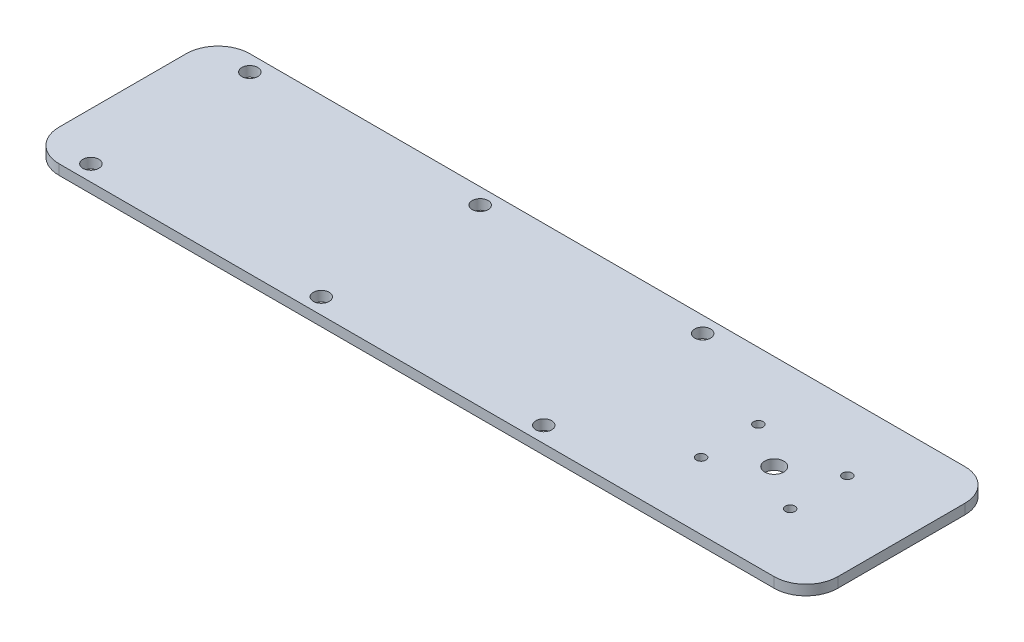
ISO-10303-21;
HEADER;
FILE_DESCRIPTION(('STEP AP214'),'2;1');
FILE_NAME('part.step','',(''),(''),'','','');
FILE_SCHEMA(('AUTOMOTIVE_DESIGN { 1 0 10303 214 1 1 1 1 }'));
ENDSEC;
DATA;
#1=APPLICATION_CONTEXT('core data for automotive mechanical design processes');
#2=APPLICATION_PROTOCOL_DEFINITION('international standard','automotive_design',2000,#1);
#3=PRODUCT_CONTEXT('',#1,'mechanical');
#4=PRODUCT('Part','Part','',(#3));
#5=PRODUCT_RELATED_PRODUCT_CATEGORY('part','',(#4));
#6=PRODUCT_DEFINITION_FORMATION('','',#4);
#7=PRODUCT_DEFINITION_CONTEXT('part definition',#1,'design');
#8=PRODUCT_DEFINITION('design','',#6,#7);
#9=PRODUCT_DEFINITION_SHAPE('','',#8);
#10=(LENGTH_UNIT() NAMED_UNIT(*) SI_UNIT(.MILLI.,.METRE.));
#11=(NAMED_UNIT(*) PLANE_ANGLE_UNIT() SI_UNIT($,.RADIAN.));
#12=(NAMED_UNIT(*) SI_UNIT($,.STERADIAN.) SOLID_ANGLE_UNIT());
#13=UNCERTAINTY_MEASURE_WITH_UNIT(LENGTH_MEASURE(1.E-05),#10,'distance_accuracy_value','');
#14=(GEOMETRIC_REPRESENTATION_CONTEXT(3) GLOBAL_UNCERTAINTY_ASSIGNED_CONTEXT((#13)) GLOBAL_UNIT_ASSIGNED_CONTEXT((#10,
#11,#12)) REPRESENTATION_CONTEXT('',''));
#15=CARTESIAN_POINT('',(0.,0.,0.));
#16=DIRECTION('',(0.,0.,1.));
#17=DIRECTION('',(1.,0.,0.));
#18=AXIS2_PLACEMENT_3D('',#15,#16,#17);
#19=CARTESIAN_POINT('',(-55.,3.175,-30.));
#20=DIRECTION('',(1.,0.,0.));
#21=DIRECTION('',(0.,0.,-1.));
#22=AXIS2_PLACEMENT_3D('',#19,#20,#21);
#23=PLANE('',#22);
#24=DIRECTION('',(0.,0.,1.));
#25=VECTOR('',#24,1.);
#26=CARTESIAN_POINT('',(-55.,0.,-30.));
#27=LINE('',#26,#25);
#28=CARTESIAN_POINT('',(-55.,0.,-20.));
#29=VERTEX_POINT('',#28);
#30=CARTESIAN_POINT('',(-55.,0.,20.));
#31=VERTEX_POINT('',#30);
#32=EDGE_CURVE('E138',#29,#31,#27,.T.);
#33=ORIENTED_EDGE('',*,*,#32,.T.);
#34=DIRECTION('',(0.,-1.,0.));
#35=VECTOR('',#34,1.);
#36=CARTESIAN_POINT('',(-55.,3.175,20.));
#37=LINE('',#36,#35);
#38=CARTESIAN_POINT('',(-55.,3.175,20.));
#39=VERTEX_POINT('',#38);
#40=EDGE_CURVE('E112',#31,#39,#37,.F.);
#41=ORIENTED_EDGE('',*,*,#40,.T.);
#42=DIRECTION('',(0.,0.,1.));
#43=VECTOR('',#42,1.);
#44=CARTESIAN_POINT('',(-55.,3.175,-30.));
#45=LINE('',#44,#43);
#46=CARTESIAN_POINT('',(-55.,3.175,-20.));
#47=VERTEX_POINT('',#46);
#48=EDGE_CURVE('E151',#47,#39,#45,.T.);
#49=ORIENTED_EDGE('',*,*,#48,.F.);
#50=DIRECTION('',(0.,-1.,0.));
#51=VECTOR('',#50,1.);
#52=CARTESIAN_POINT('',(-55.,3.175,-20.));
#53=LINE('',#52,#51);
#54=EDGE_CURVE('E118',#47,#29,#53,.T.);
#55=ORIENTED_EDGE('',*,*,#54,.T.);
#56=EDGE_LOOP('',(#33,#41,#49,#55));
#57=FACE_BOUND('',#56,.T.);
#58=ADVANCED_FACE('F39',(#57),#23,.F.);
#59=CARTESIAN_POINT('',(-55.,3.175,30.));
#60=DIRECTION('',(0.,0.,-1.));
#61=DIRECTION('',(-1.,0.,0.));
#62=AXIS2_PLACEMENT_3D('',#59,#60,#61);
#63=PLANE('',#62);
#64=DIRECTION('',(1.,0.,0.));
#65=VECTOR('',#64,1.);
#66=CARTESIAN_POINT('',(-55.,3.175,30.));
#67=LINE('',#66,#65);
#68=CARTESIAN_POINT('',(-45.,3.175,30.));
#69=VERTEX_POINT('',#68);
#70=CARTESIAN_POINT('',(180.,3.175,30.));
#71=VERTEX_POINT('',#70);
#72=EDGE_CURVE('E128',#69,#71,#67,.T.);
#73=ORIENTED_EDGE('',*,*,#72,.F.);
#74=DIRECTION('',(0.,-1.,0.));
#75=VECTOR('',#74,1.);
#76=CARTESIAN_POINT('',(-45.,3.175,30.));
#77=LINE('',#76,#75);
#78=CARTESIAN_POINT('',(-45.,0.,30.));
#79=VERTEX_POINT('',#78);
#80=EDGE_CURVE('E111',#69,#79,#77,.T.);
#81=ORIENTED_EDGE('',*,*,#80,.T.);
#82=DIRECTION('',(1.,0.,0.));
#83=VECTOR('',#82,1.);
#84=CARTESIAN_POINT('',(-55.,0.,30.));
#85=LINE('',#84,#83);
#86=CARTESIAN_POINT('',(180.,0.,30.));
#87=VERTEX_POINT('',#86);
#88=EDGE_CURVE('E125',#79,#87,#85,.T.);
#89=ORIENTED_EDGE('',*,*,#88,.T.);
#90=DIRECTION('',(0.,-1.,0.));
#91=VECTOR('',#90,1.);
#92=CARTESIAN_POINT('',(180.,3.175,30.));
#93=LINE('',#92,#91);
#94=EDGE_CURVE('E131',#87,#71,#93,.F.);
#95=ORIENTED_EDGE('',*,*,#94,.T.);
#96=EDGE_LOOP('',(#73,#81,#89,#95));
#97=FACE_BOUND('',#96,.T.);
#98=ADVANCED_FACE('F124',(#97),#63,.F.);
#99=CARTESIAN_POINT('',(190.,3.175,-30.));
#100=DIRECTION('',(-1.,0.,0.));
#101=DIRECTION('',(0.,0.,1.));
#102=AXIS2_PLACEMENT_3D('',#99,#100,#101);
#103=PLANE('',#102);
#104=DIRECTION('',(0.,0.,-1.));
#105=VECTOR('',#104,1.);
#106=CARTESIAN_POINT('',(190.,3.175,-30.));
#107=LINE('',#106,#105);
#108=CARTESIAN_POINT('',(190.,3.175,20.));
#109=VERTEX_POINT('',#108);
#110=CARTESIAN_POINT('',(190.,3.175,-20.));
#111=VERTEX_POINT('',#110);
#112=EDGE_CURVE('E187',#109,#111,#107,.T.);
#113=ORIENTED_EDGE('',*,*,#112,.F.);
#114=DIRECTION('',(0.,-1.,0.));
#115=VECTOR('',#114,1.);
#116=CARTESIAN_POINT('',(190.,3.175,20.));
#117=LINE('',#116,#115);
#118=CARTESIAN_POINT('',(190.,0.,20.));
#119=VERTEX_POINT('',#118);
#120=EDGE_CURVE('E11',#109,#119,#117,.T.);
#121=ORIENTED_EDGE('',*,*,#120,.T.);
#122=DIRECTION('',(0.,0.,-1.));
#123=VECTOR('',#122,1.);
#124=CARTESIAN_POINT('',(190.,0.,-30.));
#125=LINE('',#124,#123);
#126=CARTESIAN_POINT('',(190.,0.,-20.));
#127=VERTEX_POINT('',#126);
#128=EDGE_CURVE('E137',#119,#127,#125,.T.);
#129=ORIENTED_EDGE('',*,*,#128,.T.);
#130=DIRECTION('',(0.,-1.,0.));
#131=VECTOR('',#130,1.);
#132=CARTESIAN_POINT('',(190.,3.175,-20.));
#133=LINE('',#132,#131);
#134=EDGE_CURVE('E48',#127,#111,#133,.F.);
#135=ORIENTED_EDGE('',*,*,#134,.T.);
#136=EDGE_LOOP('',(#113,#121,#129,#135));
#137=FACE_BOUND('',#136,.T.);
#138=ADVANCED_FACE('F186',(#137),#103,.F.);
#139=CARTESIAN_POINT('',(-55.,3.175,-30.));
#140=DIRECTION('',(0.,0.,1.));
#141=DIRECTION('',(1.,0.,0.));
#142=AXIS2_PLACEMENT_3D('',#139,#140,#141);
#143=PLANE('',#142);
#144=DIRECTION('',(-1.,0.,0.));
#145=VECTOR('',#144,1.);
#146=CARTESIAN_POINT('',(-55.,0.,-30.));
#147=LINE('',#146,#145);
#148=CARTESIAN_POINT('',(180.,0.,-30.));
#149=VERTEX_POINT('',#148);
#150=CARTESIAN_POINT('',(-45.,0.,-30.));
#151=VERTEX_POINT('',#150);
#152=EDGE_CURVE('E143',#149,#151,#147,.T.);
#153=ORIENTED_EDGE('',*,*,#152,.T.);
#154=DIRECTION('',(0.,-1.,0.));
#155=VECTOR('',#154,1.);
#156=CARTESIAN_POINT('',(-45.,3.175,-30.));
#157=LINE('',#156,#155);
#158=CARTESIAN_POINT('',(-45.,3.175,-30.));
#159=VERTEX_POINT('',#158);
#160=EDGE_CURVE('E55',#151,#159,#157,.F.);
#161=ORIENTED_EDGE('',*,*,#160,.T.);
#162=DIRECTION('',(-1.,0.,0.));
#163=VECTOR('',#162,1.);
#164=CARTESIAN_POINT('',(-55.,3.175,-30.));
#165=LINE('',#164,#163);
#166=CARTESIAN_POINT('',(180.,3.175,-30.));
#167=VERTEX_POINT('',#166);
#168=EDGE_CURVE('E153',#167,#159,#165,.T.);
#169=ORIENTED_EDGE('',*,*,#168,.F.);
#170=DIRECTION('',(0.,-1.,0.));
#171=VECTOR('',#170,1.);
#172=CARTESIAN_POINT('',(180.,3.175,-30.));
#173=LINE('',#172,#171);
#174=EDGE_CURVE('E177',#167,#149,#173,.T.);
#175=ORIENTED_EDGE('',*,*,#174,.T.);
#176=EDGE_LOOP('',(#153,#161,#169,#175));
#177=FACE_BOUND('',#176,.T.);
#178=ADVANCED_FACE('F197',(#177),#143,.F.);
#179=CARTESIAN_POINT('',(0.,3.175,0.));
#180=DIRECTION('',(0.,1.,0.));
#181=DIRECTION('',(0.,0.,1.));
#182=AXIS2_PLACEMENT_3D('',#179,#180,#181);
#183=PLANE('',#182);
#184=CARTESIAN_POINT('',(32.5,3.175,25.));
#185=DIRECTION('',(0.,1.,0.));
#186=DIRECTION('',(0.,0.,1.));
#187=AXIS2_PLACEMENT_3D('',#184,#185,#186);
#188=CIRCLE('',#187,2.5);
#189=CARTESIAN_POINT('',(32.5,3.175,27.5));
#190=VERTEX_POINT('',#189);
#191=EDGE_CURVE('E293',#190,#190,#188,.T.);
#192=ORIENTED_EDGE('',*,*,#191,.F.);
#193=EDGE_LOOP('',(#192));
#194=FACE_BOUND('',#193,.T.);
#195=CARTESIAN_POINT('',(102.5,3.175,25.));
#196=DIRECTION('',(0.,1.,0.));
#197=DIRECTION('',(0.,0.,1.));
#198=AXIS2_PLACEMENT_3D('',#195,#196,#197);
#199=CIRCLE('',#198,2.5);
#200=CARTESIAN_POINT('',(102.5,3.175,27.5));
#201=VERTEX_POINT('',#200);
#202=EDGE_CURVE('E285',#201,#201,#199,.T.);
#203=ORIENTED_EDGE('',*,*,#202,.F.);
#204=EDGE_LOOP('',(#203));
#205=FACE_BOUND('',#204,.T.);
#206=CARTESIAN_POINT('',(102.5,3.175,-25.));
#207=DIRECTION('',(0.,1.,0.));
#208=DIRECTION('',(0.,0.,1.));
#209=AXIS2_PLACEMENT_3D('',#206,#207,#208);
#210=CIRCLE('',#209,2.5);
#211=CARTESIAN_POINT('',(102.5,3.175,-22.5));
#212=VERTEX_POINT('',#211);
#213=EDGE_CURVE('E277',#212,#212,#210,.T.);
#214=ORIENTED_EDGE('',*,*,#213,.F.);
#215=EDGE_LOOP('',(#214));
#216=FACE_BOUND('',#215,.T.);
#217=CARTESIAN_POINT('',(32.5,3.175,-25.));
#218=DIRECTION('',(0.,1.,0.));
#219=DIRECTION('',(0.,0.,1.));
#220=AXIS2_PLACEMENT_3D('',#217,#218,#219);
#221=CIRCLE('',#220,2.5);
#222=CARTESIAN_POINT('',(32.5,3.175,-22.5));
#223=VERTEX_POINT('',#222);
#224=EDGE_CURVE('E269',#223,#223,#221,.T.);
#225=ORIENTED_EDGE('',*,*,#224,.F.);
#226=EDGE_LOOP('',(#225));
#227=FACE_BOUND('',#226,.T.);
#228=CARTESIAN_POINT('',(-40.,3.175,25.));
#229=DIRECTION('',(0.,1.,0.));
#230=DIRECTION('',(0.,0.,1.));
#231=AXIS2_PLACEMENT_3D('',#228,#229,#230);
#232=CIRCLE('',#231,2.5);
#233=CARTESIAN_POINT('',(-40.,3.175,27.5));
#234=VERTEX_POINT('',#233);
#235=EDGE_CURVE('E261',#234,#234,#232,.T.);
#236=ORIENTED_EDGE('',*,*,#235,.F.);
#237=EDGE_LOOP('',(#236));
#238=FACE_BOUND('',#237,.T.);
#239=CARTESIAN_POINT('',(-40.,3.175,-25.));
#240=DIRECTION('',(0.,1.,0.));
#241=DIRECTION('',(0.,0.,1.));
#242=AXIS2_PLACEMENT_3D('',#239,#240,#241);
#243=CIRCLE('',#242,2.5);
#244=CARTESIAN_POINT('',(-40.,3.175,-22.5));
#245=VERTEX_POINT('',#244);
#246=EDGE_CURVE('E253',#245,#245,#243,.T.);
#247=ORIENTED_EDGE('',*,*,#246,.F.);
#248=EDGE_LOOP('',(#247));
#249=FACE_BOUND('',#248,.T.);
#250=CARTESIAN_POINT('',(164.,3.175,9.00000000000026));
#251=DIRECTION('',(0.,1.,0.));
#252=DIRECTION('',(0.,0.,1.));
#253=AXIS2_PLACEMENT_3D('',#250,#251,#252);
#254=CIRCLE('',#253,1.5);
#255=CARTESIAN_POINT('',(164.,3.175,10.5000000000003));
#256=VERTEX_POINT('',#255);
#257=EDGE_CURVE('E245',#256,#256,#254,.T.);
#258=ORIENTED_EDGE('',*,*,#257,.F.);
#259=EDGE_LOOP('',(#258));
#260=FACE_BOUND('',#259,.T.);
#261=CARTESIAN_POINT('',(136.,3.175,9.00000000000045));
#262=DIRECTION('',(0.,1.,0.));
#263=DIRECTION('',(0.,0.,1.));
#264=AXIS2_PLACEMENT_3D('',#261,#262,#263);
#265=CIRCLE('',#264,1.5);
#266=CARTESIAN_POINT('',(136.,3.175,10.5000000000005));
#267=VERTEX_POINT('',#266);
#268=EDGE_CURVE('E237',#267,#267,#265,.T.);
#269=ORIENTED_EDGE('',*,*,#268,.F.);
#270=EDGE_LOOP('',(#269));
#271=FACE_BOUND('',#270,.T.);
#272=CARTESIAN_POINT('',(136.,3.175,-8.99999999999955));
#273=DIRECTION('',(0.,1.,0.));
#274=DIRECTION('',(0.,0.,1.));
#275=AXIS2_PLACEMENT_3D('',#272,#273,#274);
#276=CIRCLE('',#275,1.5);
#277=CARTESIAN_POINT('',(136.,3.175,-7.49999999999955));
#278=VERTEX_POINT('',#277);
#279=EDGE_CURVE('E229',#278,#278,#276,.T.);
#280=ORIENTED_EDGE('',*,*,#279,.F.);
#281=EDGE_LOOP('',(#280));
#282=FACE_BOUND('',#281,.T.);
#283=CARTESIAN_POINT('',(164.,3.175,-8.99999999999974));
#284=DIRECTION('',(0.,1.,0.));
#285=DIRECTION('',(0.,0.,1.));
#286=AXIS2_PLACEMENT_3D('',#283,#284,#285);
#287=CIRCLE('',#286,1.5);
#288=CARTESIAN_POINT('',(164.,3.175,-7.49999999999974));
#289=VERTEX_POINT('',#288);
#290=EDGE_CURVE('E221',#289,#289,#287,.T.);
#291=ORIENTED_EDGE('',*,*,#290,.F.);
#292=EDGE_LOOP('',(#291));
#293=FACE_BOUND('',#292,.T.);
#294=CARTESIAN_POINT('',(150.,3.175,0.));
#295=DIRECTION('',(0.,1.,0.));
#296=DIRECTION('',(0.,0.,1.));
#297=AXIS2_PLACEMENT_3D('',#294,#295,#296);
#298=CIRCLE('',#297,2.99999999999998);
#299=CARTESIAN_POINT('',(150.,3.175,2.99999999999998));
#300=VERTEX_POINT('',#299);
#301=EDGE_CURVE('E213',#300,#300,#298,.T.);
#302=ORIENTED_EDGE('',*,*,#301,.F.);
#303=EDGE_LOOP('',(#302));
#304=FACE_BOUND('',#303,.T.);
#305=ORIENTED_EDGE('',*,*,#48,.T.);
#306=CARTESIAN_POINT('',(-45.,3.175,20.));
#307=DIRECTION('',(0.,1.,0.));
#308=DIRECTION('',(0.,0.,1.));
#309=AXIS2_PLACEMENT_3D('',#306,#307,#308);
#310=CIRCLE('',#309,10.);
#311=EDGE_CURVE('E174',#39,#69,#310,.T.);
#312=ORIENTED_EDGE('',*,*,#311,.T.);
#313=ORIENTED_EDGE('',*,*,#72,.T.);
#314=CARTESIAN_POINT('',(180.,3.175,20.));
#315=DIRECTION('',(0.,1.,0.));
#316=DIRECTION('',(0.,0.,1.));
#317=AXIS2_PLACEMENT_3D('',#314,#315,#316);
#318=CIRCLE('',#317,10.);
#319=EDGE_CURVE('E168',#71,#109,#318,.T.);
#320=ORIENTED_EDGE('',*,*,#319,.T.);
#321=ORIENTED_EDGE('',*,*,#112,.T.);
#322=CARTESIAN_POINT('',(180.,3.175,-20.));
#323=DIRECTION('',(0.,1.,0.));
#324=DIRECTION('',(0.,0.,1.));
#325=AXIS2_PLACEMENT_3D('',#322,#323,#324);
#326=CIRCLE('',#325,10.);
#327=EDGE_CURVE('E62',#111,#167,#326,.T.);
#328=ORIENTED_EDGE('',*,*,#327,.T.);
#329=ORIENTED_EDGE('',*,*,#168,.T.);
#330=CARTESIAN_POINT('',(-45.,3.175,-20.));
#331=DIRECTION('',(0.,1.,0.));
#332=DIRECTION('',(0.,0.,1.));
#333=AXIS2_PLACEMENT_3D('',#330,#331,#332);
#334=CIRCLE('',#333,10.);
#335=EDGE_CURVE('E171',#159,#47,#334,.T.);
#336=ORIENTED_EDGE('',*,*,#335,.T.);
#337=EDGE_LOOP('',(#305,#312,#313,#320,#321,#328,#329,#336));
#338=FACE_BOUND('',#337,.T.);
#339=ADVANCED_FACE('F191',(#194,#205,#216,#227,#238,#249,#260,#271,#282,#293,#304,#338),#183,.T.);
#340=CARTESIAN_POINT('',(0.,0.,0.));
#341=DIRECTION('',(0.,1.,0.));
#342=DIRECTION('',(0.,0.,1.));
#343=AXIS2_PLACEMENT_3D('',#340,#341,#342);
#344=PLANE('',#343);
#345=CARTESIAN_POINT('',(32.5,0.,25.));
#346=DIRECTION('',(0.,1.,0.));
#347=DIRECTION('',(0.,0.,1.));
#348=AXIS2_PLACEMENT_3D('',#345,#346,#347);
#349=CIRCLE('',#348,2.5);
#350=CARTESIAN_POINT('',(32.5,0.,27.5));
#351=VERTEX_POINT('',#350);
#352=EDGE_CURVE('E289',#351,#351,#349,.T.);
#353=ORIENTED_EDGE('',*,*,#352,.T.);
#354=EDGE_LOOP('',(#353));
#355=FACE_BOUND('',#354,.T.);
#356=CARTESIAN_POINT('',(102.5,0.,25.));
#357=DIRECTION('',(0.,1.,0.));
#358=DIRECTION('',(0.,0.,1.));
#359=AXIS2_PLACEMENT_3D('',#356,#357,#358);
#360=CIRCLE('',#359,2.5);
#361=CARTESIAN_POINT('',(102.5,0.,27.5));
#362=VERTEX_POINT('',#361);
#363=EDGE_CURVE('E281',#362,#362,#360,.T.);
#364=ORIENTED_EDGE('',*,*,#363,.T.);
#365=EDGE_LOOP('',(#364));
#366=FACE_BOUND('',#365,.T.);
#367=CARTESIAN_POINT('',(102.5,0.,-25.));
#368=DIRECTION('',(0.,1.,0.));
#369=DIRECTION('',(0.,0.,1.));
#370=AXIS2_PLACEMENT_3D('',#367,#368,#369);
#371=CIRCLE('',#370,2.5);
#372=CARTESIAN_POINT('',(102.5,0.,-22.5));
#373=VERTEX_POINT('',#372);
#374=EDGE_CURVE('E273',#373,#373,#371,.T.);
#375=ORIENTED_EDGE('',*,*,#374,.T.);
#376=EDGE_LOOP('',(#375));
#377=FACE_BOUND('',#376,.T.);
#378=CARTESIAN_POINT('',(32.5,0.,-25.));
#379=DIRECTION('',(0.,1.,0.));
#380=DIRECTION('',(0.,0.,1.));
#381=AXIS2_PLACEMENT_3D('',#378,#379,#380);
#382=CIRCLE('',#381,2.5);
#383=CARTESIAN_POINT('',(32.5,0.,-22.5));
#384=VERTEX_POINT('',#383);
#385=EDGE_CURVE('E265',#384,#384,#382,.T.);
#386=ORIENTED_EDGE('',*,*,#385,.T.);
#387=EDGE_LOOP('',(#386));
#388=FACE_BOUND('',#387,.T.);
#389=CARTESIAN_POINT('',(-40.,0.,25.));
#390=DIRECTION('',(0.,1.,0.));
#391=DIRECTION('',(0.,0.,1.));
#392=AXIS2_PLACEMENT_3D('',#389,#390,#391);
#393=CIRCLE('',#392,2.5);
#394=CARTESIAN_POINT('',(-40.,0.,27.5));
#395=VERTEX_POINT('',#394);
#396=EDGE_CURVE('E257',#395,#395,#393,.T.);
#397=ORIENTED_EDGE('',*,*,#396,.T.);
#398=EDGE_LOOP('',(#397));
#399=FACE_BOUND('',#398,.T.);
#400=CARTESIAN_POINT('',(-40.,0.,-25.));
#401=DIRECTION('',(0.,1.,0.));
#402=DIRECTION('',(0.,0.,1.));
#403=AXIS2_PLACEMENT_3D('',#400,#401,#402);
#404=CIRCLE('',#403,2.5);
#405=CARTESIAN_POINT('',(-40.,0.,-22.5));
#406=VERTEX_POINT('',#405);
#407=EDGE_CURVE('E249',#406,#406,#404,.T.);
#408=ORIENTED_EDGE('',*,*,#407,.T.);
#409=EDGE_LOOP('',(#408));
#410=FACE_BOUND('',#409,.T.);
#411=CARTESIAN_POINT('',(164.,0.,9.00000000000026));
#412=DIRECTION('',(0.,1.,0.));
#413=DIRECTION('',(0.,0.,1.));
#414=AXIS2_PLACEMENT_3D('',#411,#412,#413);
#415=CIRCLE('',#414,1.5);
#416=CARTESIAN_POINT('',(164.,0.,10.5000000000003));
#417=VERTEX_POINT('',#416);
#418=EDGE_CURVE('E241',#417,#417,#415,.T.);
#419=ORIENTED_EDGE('',*,*,#418,.T.);
#420=EDGE_LOOP('',(#419));
#421=FACE_BOUND('',#420,.T.);
#422=CARTESIAN_POINT('',(136.,0.,9.00000000000045));
#423=DIRECTION('',(0.,1.,0.));
#424=DIRECTION('',(0.,0.,1.));
#425=AXIS2_PLACEMENT_3D('',#422,#423,#424);
#426=CIRCLE('',#425,1.5);
#427=CARTESIAN_POINT('',(136.,0.,10.5000000000005));
#428=VERTEX_POINT('',#427);
#429=EDGE_CURVE('E233',#428,#428,#426,.T.);
#430=ORIENTED_EDGE('',*,*,#429,.T.);
#431=EDGE_LOOP('',(#430));
#432=FACE_BOUND('',#431,.T.);
#433=CARTESIAN_POINT('',(136.,0.,-8.99999999999955));
#434=DIRECTION('',(0.,1.,0.));
#435=DIRECTION('',(0.,0.,1.));
#436=AXIS2_PLACEMENT_3D('',#433,#434,#435);
#437=CIRCLE('',#436,1.5);
#438=CARTESIAN_POINT('',(136.,0.,-7.49999999999955));
#439=VERTEX_POINT('',#438);
#440=EDGE_CURVE('E225',#439,#439,#437,.T.);
#441=ORIENTED_EDGE('',*,*,#440,.T.);
#442=EDGE_LOOP('',(#441));
#443=FACE_BOUND('',#442,.T.);
#444=CARTESIAN_POINT('',(164.,0.,-8.99999999999974));
#445=DIRECTION('',(0.,1.,0.));
#446=DIRECTION('',(0.,0.,1.));
#447=AXIS2_PLACEMENT_3D('',#444,#445,#446);
#448=CIRCLE('',#447,1.5);
#449=CARTESIAN_POINT('',(164.,0.,-7.49999999999974));
#450=VERTEX_POINT('',#449);
#451=EDGE_CURVE('E217',#450,#450,#448,.T.);
#452=ORIENTED_EDGE('',*,*,#451,.T.);
#453=EDGE_LOOP('',(#452));
#454=FACE_BOUND('',#453,.T.);
#455=CARTESIAN_POINT('',(150.,0.,0.));
#456=DIRECTION('',(0.,1.,0.));
#457=DIRECTION('',(0.,0.,1.));
#458=AXIS2_PLACEMENT_3D('',#455,#456,#457);
#459=CIRCLE('',#458,2.99999999999999);
#460=CARTESIAN_POINT('',(150.,0.,2.99999999999999));
#461=VERTEX_POINT('',#460);
#462=EDGE_CURVE('E145',#461,#461,#459,.T.);
#463=ORIENTED_EDGE('',*,*,#462,.T.);
#464=EDGE_LOOP('',(#463));
#465=FACE_BOUND('',#464,.T.);
#466=ORIENTED_EDGE('',*,*,#88,.F.);
#467=CARTESIAN_POINT('',(-45.,0.,20.));
#468=DIRECTION('',(0.,1.,0.));
#469=DIRECTION('',(0.,0.,1.));
#470=AXIS2_PLACEMENT_3D('',#467,#468,#469);
#471=CIRCLE('',#470,10.);
#472=EDGE_CURVE('E107',#79,#31,#471,.F.);
#473=ORIENTED_EDGE('',*,*,#472,.T.);
#474=ORIENTED_EDGE('',*,*,#32,.F.);
#475=CARTESIAN_POINT('',(-45.,0.,-20.));
#476=DIRECTION('',(0.,1.,0.));
#477=DIRECTION('',(0.,0.,1.));
#478=AXIS2_PLACEMENT_3D('',#475,#476,#477);
#479=CIRCLE('',#478,10.);
#480=EDGE_CURVE('E119',#29,#151,#479,.F.);
#481=ORIENTED_EDGE('',*,*,#480,.T.);
#482=ORIENTED_EDGE('',*,*,#152,.F.);
#483=CARTESIAN_POINT('',(180.,0.,-20.));
#484=DIRECTION('',(0.,1.,0.));
#485=DIRECTION('',(0.,0.,1.));
#486=AXIS2_PLACEMENT_3D('',#483,#484,#485);
#487=CIRCLE('',#486,10.);
#488=EDGE_CURVE('E130',#149,#127,#487,.F.);
#489=ORIENTED_EDGE('',*,*,#488,.T.);
#490=ORIENTED_EDGE('',*,*,#128,.F.);
#491=CARTESIAN_POINT('',(180.,0.,20.));
#492=DIRECTION('',(0.,1.,0.));
#493=DIRECTION('',(0.,0.,1.));
#494=AXIS2_PLACEMENT_3D('',#491,#492,#493);
#495=CIRCLE('',#494,10.);
#496=EDGE_CURVE('E135',#119,#87,#495,.F.);
#497=ORIENTED_EDGE('',*,*,#496,.T.);
#498=EDGE_LOOP('',(#466,#473,#474,#481,#482,#489,#490,#497));
#499=FACE_BOUND('',#498,.T.);
#500=ADVANCED_FACE('F133',(#355,#366,#377,#388,#399,#410,#421,#432,#443,#454,#465,#499),#344,.F.);
#501=CARTESIAN_POINT('',(-45.,3.175,20.));
#502=DIRECTION('',(0.,-1.,0.));
#503=DIRECTION('',(0.,0.,-1.));
#504=AXIS2_PLACEMENT_3D('',#501,#502,#503);
#505=CYLINDRICAL_SURFACE('',#504,10.);
#506=ORIENTED_EDGE('',*,*,#311,.F.);
#507=ORIENTED_EDGE('',*,*,#40,.F.);
#508=ORIENTED_EDGE('',*,*,#472,.F.);
#509=ORIENTED_EDGE('',*,*,#80,.F.);
#510=EDGE_LOOP('',(#506,#507,#508,#509));
#511=FACE_BOUND('',#510,.T.);
#512=ADVANCED_FACE('F110',(#511),#505,.T.);
#513=CARTESIAN_POINT('',(-45.,3.175,-20.));
#514=DIRECTION('',(0.,-1.,0.));
#515=DIRECTION('',(0.,0.,-1.));
#516=AXIS2_PLACEMENT_3D('',#513,#514,#515);
#517=CYLINDRICAL_SURFACE('',#516,10.);
#518=ORIENTED_EDGE('',*,*,#335,.F.);
#519=ORIENTED_EDGE('',*,*,#160,.F.);
#520=ORIENTED_EDGE('',*,*,#480,.F.);
#521=ORIENTED_EDGE('',*,*,#54,.F.);
#522=EDGE_LOOP('',(#518,#519,#520,#521));
#523=FACE_BOUND('',#522,.T.);
#524=ADVANCED_FACE('F201',(#523),#517,.T.);
#525=CARTESIAN_POINT('',(180.,3.175,20.));
#526=DIRECTION('',(0.,-1.,0.));
#527=DIRECTION('',(0.,0.,-1.));
#528=AXIS2_PLACEMENT_3D('',#525,#526,#527);
#529=CYLINDRICAL_SURFACE('',#528,10.);
#530=ORIENTED_EDGE('',*,*,#319,.F.);
#531=ORIENTED_EDGE('',*,*,#94,.F.);
#532=ORIENTED_EDGE('',*,*,#496,.F.);
#533=ORIENTED_EDGE('',*,*,#120,.F.);
#534=EDGE_LOOP('',(#530,#531,#532,#533));
#535=FACE_BOUND('',#534,.T.);
#536=ADVANCED_FACE('F335',(#535),#529,.T.);
#537=CARTESIAN_POINT('',(180.,3.175,-20.));
#538=DIRECTION('',(0.,-1.,0.));
#539=DIRECTION('',(0.,0.,-1.));
#540=AXIS2_PLACEMENT_3D('',#537,#538,#539);
#541=CYLINDRICAL_SURFACE('',#540,10.);
#542=ORIENTED_EDGE('',*,*,#327,.F.);
#543=ORIENTED_EDGE('',*,*,#134,.F.);
#544=ORIENTED_EDGE('',*,*,#488,.F.);
#545=ORIENTED_EDGE('',*,*,#174,.F.);
#546=EDGE_LOOP('',(#542,#543,#544,#545));
#547=FACE_BOUND('',#546,.T.);
#548=ADVANCED_FACE('F41',(#547),#541,.T.);
#549=CARTESIAN_POINT('',(150.,3.175,0.));
#550=DIRECTION('',(0.,1.,0.));
#551=DIRECTION('',(0.,0.,1.));
#552=AXIS2_PLACEMENT_3D('',#549,#550,#551);
#553=CYLINDRICAL_SURFACE('',#552,2.99999999999999);
#554=ORIENTED_EDGE('',*,*,#462,.F.);
#555=EDGE_LOOP('',(#554));
#556=FACE_BOUND('',#555,.T.);
#557=ORIENTED_EDGE('',*,*,#301,.T.);
#558=EDGE_LOOP('',(#557));
#559=FACE_BOUND('',#558,.T.);
#560=ADVANCED_FACE('F323',(#556,#559),#553,.F.);
#561=CARTESIAN_POINT('',(164.,3.175,-8.99999999999974));
#562=DIRECTION('',(0.,1.,0.));
#563=DIRECTION('',(0.,0.,1.));
#564=AXIS2_PLACEMENT_3D('',#561,#562,#563);
#565=CYLINDRICAL_SURFACE('',#564,1.5);
#566=ORIENTED_EDGE('',*,*,#451,.F.);
#567=EDGE_LOOP('',(#566));
#568=FACE_BOUND('',#567,.T.);
#569=ORIENTED_EDGE('',*,*,#290,.T.);
#570=EDGE_LOOP('',(#569));
#571=FACE_BOUND('',#570,.T.);
#572=ADVANCED_FACE('F325',(#568,#571),#565,.F.);
#573=CARTESIAN_POINT('',(136.,3.175,-8.99999999999955));
#574=DIRECTION('',(0.,1.,0.));
#575=DIRECTION('',(0.,0.,1.));
#576=AXIS2_PLACEMENT_3D('',#573,#574,#575);
#577=CYLINDRICAL_SURFACE('',#576,1.5);
#578=ORIENTED_EDGE('',*,*,#440,.F.);
#579=EDGE_LOOP('',(#578));
#580=FACE_BOUND('',#579,.T.);
#581=ORIENTED_EDGE('',*,*,#279,.T.);
#582=EDGE_LOOP('',(#581));
#583=FACE_BOUND('',#582,.T.);
#584=ADVANCED_FACE('F332',(#580,#583),#577,.F.);
#585=CARTESIAN_POINT('',(136.,3.175,9.00000000000045));
#586=DIRECTION('',(0.,1.,0.));
#587=DIRECTION('',(0.,0.,1.));
#588=AXIS2_PLACEMENT_3D('',#585,#586,#587);
#589=CYLINDRICAL_SURFACE('',#588,1.5);
#590=ORIENTED_EDGE('',*,*,#429,.F.);
#591=EDGE_LOOP('',(#590));
#592=FACE_BOUND('',#591,.T.);
#593=ORIENTED_EDGE('',*,*,#268,.T.);
#594=EDGE_LOOP('',(#593));
#595=FACE_BOUND('',#594,.T.);
#596=ADVANCED_FACE('F377',(#592,#595),#589,.F.);
#597=CARTESIAN_POINT('',(164.,3.175,9.00000000000026));
#598=DIRECTION('',(0.,1.,0.));
#599=DIRECTION('',(0.,0.,1.));
#600=AXIS2_PLACEMENT_3D('',#597,#598,#599);
#601=CYLINDRICAL_SURFACE('',#600,1.5);
#602=ORIENTED_EDGE('',*,*,#418,.F.);
#603=EDGE_LOOP('',(#602));
#604=FACE_BOUND('',#603,.T.);
#605=ORIENTED_EDGE('',*,*,#257,.T.);
#606=EDGE_LOOP('',(#605));
#607=FACE_BOUND('',#606,.T.);
#608=ADVANCED_FACE('F387',(#604,#607),#601,.F.);
#609=CARTESIAN_POINT('',(-40.,3.175,-25.));
#610=DIRECTION('',(0.,1.,0.));
#611=DIRECTION('',(0.,0.,1.));
#612=AXIS2_PLACEMENT_3D('',#609,#610,#611);
#613=CYLINDRICAL_SURFACE('',#612,2.5);
#614=ORIENTED_EDGE('',*,*,#407,.F.);
#615=EDGE_LOOP('',(#614));
#616=FACE_BOUND('',#615,.T.);
#617=ORIENTED_EDGE('',*,*,#246,.T.);
#618=EDGE_LOOP('',(#617));
#619=FACE_BOUND('',#618,.T.);
#620=ADVANCED_FACE('F397',(#616,#619),#613,.F.);
#621=CARTESIAN_POINT('',(-40.,3.175,25.));
#622=DIRECTION('',(0.,1.,0.));
#623=DIRECTION('',(0.,0.,1.));
#624=AXIS2_PLACEMENT_3D('',#621,#622,#623);
#625=CYLINDRICAL_SURFACE('',#624,2.5);
#626=ORIENTED_EDGE('',*,*,#396,.F.);
#627=EDGE_LOOP('',(#626));
#628=FACE_BOUND('',#627,.T.);
#629=ORIENTED_EDGE('',*,*,#235,.T.);
#630=EDGE_LOOP('',(#629));
#631=FACE_BOUND('',#630,.T.);
#632=ADVANCED_FACE('F425',(#628,#631),#625,.F.);
#633=CARTESIAN_POINT('',(32.5,3.175,-25.));
#634=DIRECTION('',(0.,1.,0.));
#635=DIRECTION('',(0.,0.,1.));
#636=AXIS2_PLACEMENT_3D('',#633,#634,#635);
#637=CYLINDRICAL_SURFACE('',#636,2.5);
#638=ORIENTED_EDGE('',*,*,#385,.F.);
#639=EDGE_LOOP('',(#638));
#640=FACE_BOUND('',#639,.T.);
#641=ORIENTED_EDGE('',*,*,#224,.T.);
#642=EDGE_LOOP('',(#641));
#643=FACE_BOUND('',#642,.T.);
#644=ADVANCED_FACE('F435',(#640,#643),#637,.F.);
#645=CARTESIAN_POINT('',(102.5,3.175,-25.));
#646=DIRECTION('',(0.,1.,0.));
#647=DIRECTION('',(0.,0.,1.));
#648=AXIS2_PLACEMENT_3D('',#645,#646,#647);
#649=CYLINDRICAL_SURFACE('',#648,2.5);
#650=ORIENTED_EDGE('',*,*,#374,.F.);
#651=EDGE_LOOP('',(#650));
#652=FACE_BOUND('',#651,.T.);
#653=ORIENTED_EDGE('',*,*,#213,.T.);
#654=EDGE_LOOP('',(#653));
#655=FACE_BOUND('',#654,.T.);
#656=ADVANCED_FACE('F445',(#652,#655),#649,.F.);
#657=CARTESIAN_POINT('',(102.5,3.175,25.));
#658=DIRECTION('',(0.,1.,0.));
#659=DIRECTION('',(0.,0.,1.));
#660=AXIS2_PLACEMENT_3D('',#657,#658,#659);
#661=CYLINDRICAL_SURFACE('',#660,2.5);
#662=ORIENTED_EDGE('',*,*,#363,.F.);
#663=EDGE_LOOP('',(#662));
#664=FACE_BOUND('',#663,.T.);
#665=ORIENTED_EDGE('',*,*,#202,.T.);
#666=EDGE_LOOP('',(#665));
#667=FACE_BOUND('',#666,.T.);
#668=ADVANCED_FACE('F455',(#664,#667),#661,.F.);
#669=CARTESIAN_POINT('',(32.5,3.175,25.));
#670=DIRECTION('',(0.,1.,0.));
#671=DIRECTION('',(0.,0.,1.));
#672=AXIS2_PLACEMENT_3D('',#669,#670,#671);
#673=CYLINDRICAL_SURFACE('',#672,2.5);
#674=ORIENTED_EDGE('',*,*,#352,.F.);
#675=EDGE_LOOP('',(#674));
#676=FACE_BOUND('',#675,.T.);
#677=ORIENTED_EDGE('',*,*,#191,.T.);
#678=EDGE_LOOP('',(#677));
#679=FACE_BOUND('',#678,.T.);
#680=ADVANCED_FACE('F298',(#676,#679),#673,.F.);
#681=CLOSED_SHELL('',(#58,#98,#138,#178,#339,#500,#512,#524,#536,#548,#560,#572,#584,#596,#608,
#620,#632,#644,#656,#668,#680));
#682=MANIFOLD_SOLID_BREP('B2',#681);
#683=ADVANCED_BREP_SHAPE_REPRESENTATION('',(#18,#682),#14);
#684=SHAPE_DEFINITION_REPRESENTATION(#9,#683);
ENDSEC;
END-ISO-10303-21;
